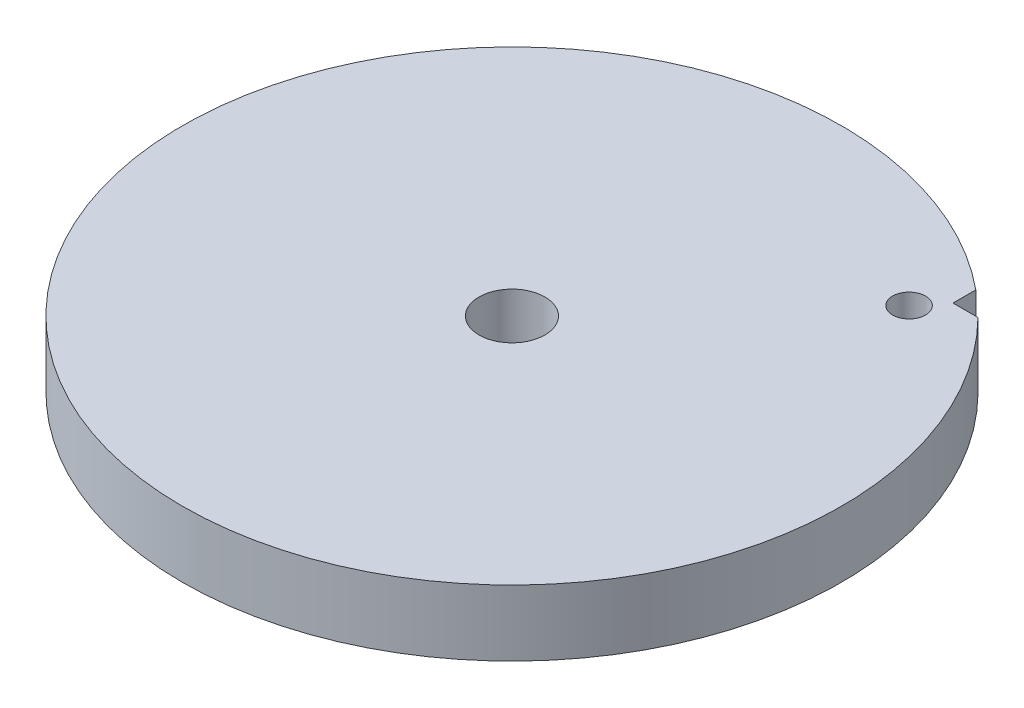
ISO-10303-21;
HEADER;
FILE_DESCRIPTION(('STEP AP214'),'2;1');
FILE_NAME('part.step','',(''),(''),'','','');
FILE_SCHEMA(('AUTOMOTIVE_DESIGN { 1 0 10303 214 1 1 1 1 }'));
ENDSEC;
DATA;
#1=APPLICATION_CONTEXT('core data for automotive mechanical design processes');
#2=APPLICATION_PROTOCOL_DEFINITION('international standard','automotive_design',2000,#1);
#3=PRODUCT_CONTEXT('',#1,'mechanical');
#4=PRODUCT('Part','Part','',(#3));
#5=PRODUCT_RELATED_PRODUCT_CATEGORY('part','',(#4));
#6=PRODUCT_DEFINITION_FORMATION('','',#4);
#7=PRODUCT_DEFINITION_CONTEXT('part definition',#1,'design');
#8=PRODUCT_DEFINITION('design','',#6,#7);
#9=PRODUCT_DEFINITION_SHAPE('','',#8);
#10=(LENGTH_UNIT() NAMED_UNIT(*) SI_UNIT(.MILLI.,.METRE.));
#11=(NAMED_UNIT(*) PLANE_ANGLE_UNIT() SI_UNIT($,.RADIAN.));
#12=(NAMED_UNIT(*) SI_UNIT($,.STERADIAN.) SOLID_ANGLE_UNIT());
#13=UNCERTAINTY_MEASURE_WITH_UNIT(LENGTH_MEASURE(1.E-05),#10,'distance_accuracy_value','');
#14=(GEOMETRIC_REPRESENTATION_CONTEXT(3) GLOBAL_UNCERTAINTY_ASSIGNED_CONTEXT((#13)) GLOBAL_UNIT_ASSIGNED_CONTEXT((#10,
#11,#12)) REPRESENTATION_CONTEXT('',''));
#15=CARTESIAN_POINT('',(0.,0.,0.));
#16=DIRECTION('',(0.,0.,1.));
#17=DIRECTION('',(1.,0.,0.));
#18=AXIS2_PLACEMENT_3D('',#15,#16,#17);
#19=CARTESIAN_POINT('',(0.,3.,0.));
#20=DIRECTION('',(0.,1.,0.));
#21=DIRECTION('',(0.,0.,1.));
#22=AXIS2_PLACEMENT_3D('',#19,#20,#21);
#23=PLANE('',#22);
#24=CARTESIAN_POINT('',(0.,3.,0.));
#25=DIRECTION('',(0.,1.,0.));
#26=DIRECTION('',(0.,0.,1.));
#27=AXIS2_PLACEMENT_3D('',#24,#25,#26);
#28=CIRCLE('',#27,1.5);
#29=CARTESIAN_POINT('',(0.,3.,1.5));
#30=VERTEX_POINT('',#29);
#31=EDGE_CURVE('E94',#30,#30,#28,.T.);
#32=ORIENTED_EDGE('',*,*,#31,.F.);
#33=EDGE_LOOP('',(#32));
#34=FACE_BOUND('',#33,.T.);
#35=CARTESIAN_POINT('',(0.,3.,0.));
#36=DIRECTION('',(0.,1.,0.));
#37=DIRECTION('',(0.,0.,1.));
#38=AXIS2_PLACEMENT_3D('',#35,#36,#37);
#39=CIRCLE('',#38,15.);
#40=CARTESIAN_POINT('',(9.52753894994287,3.,-11.5855945707297));
#41=VERTEX_POINT('',#40);
#42=CARTESIAN_POINT('',(10.6660411568137,3.,-10.5468272973988));
#43=VERTEX_POINT('',#42);
#44=EDGE_CURVE('E82',#41,#43,#39,.T.);
#45=ORIENTED_EDGE('',*,*,#44,.T.);
#46=DIRECTION('',(-1.,0.,0.));
#47=VECTOR('',#46,1.);
#48=CARTESIAN_POINT('',(9.52753894994287,3.,-10.5468272973988));
#49=LINE('',#48,#47);
#50=CARTESIAN_POINT('',(9.52753894994287,3.,-10.5468272973988));
#51=VERTEX_POINT('',#50);
#52=EDGE_CURVE('E77',#43,#51,#49,.T.);
#53=ORIENTED_EDGE('',*,*,#52,.T.);
#54=DIRECTION('',(0.,0.,-1.));
#55=VECTOR('',#54,1.);
#56=CARTESIAN_POINT('',(9.52753894994287,3.,-11.5855945707297));
#57=LINE('',#56,#55);
#58=EDGE_CURVE('E57',#51,#41,#57,.T.);
#59=ORIENTED_EDGE('',*,*,#58,.T.);
#60=EDGE_LOOP('',(#45,#53,#59));
#61=FACE_BOUND('',#60,.T.);
#62=CARTESIAN_POINT('',(8.62586921498167,3.,-9.44919669777989));
#63=DIRECTION('',(0.,1.,0.));
#64=DIRECTION('',(0.,0.,1.));
#65=AXIS2_PLACEMENT_3D('',#62,#63,#64);
#66=CIRCLE('',#65,0.75);
#67=CARTESIAN_POINT('',(8.62586921498167,3.,-8.69919669777989));
#68=VERTEX_POINT('',#67);
#69=EDGE_CURVE('E121',#68,#68,#66,.T.);
#70=ORIENTED_EDGE('',*,*,#69,.F.);
#71=EDGE_LOOP('',(#70));
#72=FACE_BOUND('',#71,.T.);
#73=ADVANCED_FACE('F39',(#34,#61,#72),#23,.T.);
#74=CARTESIAN_POINT('',(0.,0.,0.));
#75=DIRECTION('',(0.,1.,0.));
#76=DIRECTION('',(0.,0.,1.));
#77=AXIS2_PLACEMENT_3D('',#74,#75,#76);
#78=PLANE('',#77);
#79=CARTESIAN_POINT('',(0.,0.,0.));
#80=DIRECTION('',(0.,1.,0.));
#81=DIRECTION('',(0.,0.,1.));
#82=AXIS2_PLACEMENT_3D('',#79,#80,#81);
#83=CIRCLE('',#82,15.);
#84=CARTESIAN_POINT('',(9.52753894994287,0.,-11.5855945707297));
#85=VERTEX_POINT('',#84);
#86=CARTESIAN_POINT('',(10.6660411568137,0.,-10.5468272973988));
#87=VERTEX_POINT('',#86);
#88=EDGE_CURVE('E90',#85,#87,#83,.T.);
#89=ORIENTED_EDGE('',*,*,#88,.F.);
#90=DIRECTION('',(0.,0.,-1.));
#91=VECTOR('',#90,1.);
#92=CARTESIAN_POINT('',(9.52753894994287,0.,-11.5855945707297));
#93=LINE('',#92,#91);
#94=CARTESIAN_POINT('',(9.52753894994287,0.,-10.5468272973988));
#95=VERTEX_POINT('',#94);
#96=EDGE_CURVE('E74',#95,#85,#93,.T.);
#97=ORIENTED_EDGE('',*,*,#96,.F.);
#98=DIRECTION('',(-1.,0.,0.));
#99=VECTOR('',#98,1.);
#100=CARTESIAN_POINT('',(9.52753894994287,0.,-10.5468272973988));
#101=LINE('',#100,#99);
#102=EDGE_CURVE('E69',#87,#95,#101,.T.);
#103=ORIENTED_EDGE('',*,*,#102,.F.);
#104=EDGE_LOOP('',(#89,#97,#103));
#105=FACE_BOUND('',#104,.T.);
#106=CARTESIAN_POINT('',(0.,0.,0.));
#107=DIRECTION('',(0.,1.,0.));
#108=DIRECTION('',(0.,0.,1.));
#109=AXIS2_PLACEMENT_3D('',#106,#107,#108);
#110=CIRCLE('',#109,1.5);
#111=CARTESIAN_POINT('',(0.,0.,1.5));
#112=VERTEX_POINT('',#111);
#113=EDGE_CURVE('E100',#112,#112,#110,.T.);
#114=ORIENTED_EDGE('',*,*,#113,.T.);
#115=EDGE_LOOP('',(#114));
#116=FACE_BOUND('',#115,.T.);
#117=CARTESIAN_POINT('',(8.62586921498167,0.,-9.44919669777989));
#118=DIRECTION('',(0.,1.,0.));
#119=DIRECTION('',(0.,0.,1.));
#120=AXIS2_PLACEMENT_3D('',#117,#118,#119);
#121=CIRCLE('',#120,0.75);
#122=CARTESIAN_POINT('',(8.62586921498167,0.,-8.69919669777989));
#123=VERTEX_POINT('',#122);
#124=EDGE_CURVE('E118',#123,#123,#121,.T.);
#125=ORIENTED_EDGE('',*,*,#124,.T.);
#126=EDGE_LOOP('',(#125));
#127=FACE_BOUND('',#126,.T.);
#128=ADVANCED_FACE('F109',(#105,#116,#127),#78,.F.);
#129=CARTESIAN_POINT('',(0.,3.,0.));
#130=DIRECTION('',(0.,-1.,0.));
#131=DIRECTION('',(0.,0.,-1.));
#132=AXIS2_PLACEMENT_3D('',#129,#130,#131);
#133=CYLINDRICAL_SURFACE('',#132,15.);
#134=ORIENTED_EDGE('',*,*,#88,.T.);
#135=DIRECTION('',(0.,-1.,0.));
#136=VECTOR('',#135,1.);
#137=CARTESIAN_POINT('',(10.6660411568137,3.,-10.5468272973988));
#138=LINE('',#137,#136);
#139=EDGE_CURVE('E11',#43,#87,#138,.T.);
#140=ORIENTED_EDGE('',*,*,#139,.F.);
#141=ORIENTED_EDGE('',*,*,#44,.F.);
#142=DIRECTION('',(0.,-1.,0.));
#143=VECTOR('',#142,1.);
#144=CARTESIAN_POINT('',(9.52753894994287,3.,-11.5855945707297));
#145=LINE('',#144,#143);
#146=EDGE_CURVE('E91',#41,#85,#145,.T.);
#147=ORIENTED_EDGE('',*,*,#146,.T.);
#148=EDGE_LOOP('',(#134,#140,#141,#147));
#149=FACE_BOUND('',#148,.T.);
#150=ADVANCED_FACE('F41',(#149),#133,.T.);
#151=CARTESIAN_POINT('',(9.52753894994287,3.,-10.5468272973988));
#152=DIRECTION('',(0.,0.,1.));
#153=DIRECTION('',(1.,0.,0.));
#154=AXIS2_PLACEMENT_3D('',#151,#152,#153);
#155=PLANE('',#154);
#156=ORIENTED_EDGE('',*,*,#102,.T.);
#157=DIRECTION('',(0.,-1.,0.));
#158=VECTOR('',#157,1.);
#159=CARTESIAN_POINT('',(9.52753894994287,3.,-10.5468272973988));
#160=LINE('',#159,#158);
#161=EDGE_CURVE('E49',#51,#95,#160,.T.);
#162=ORIENTED_EDGE('',*,*,#161,.F.);
#163=ORIENTED_EDGE('',*,*,#52,.F.);
#164=ORIENTED_EDGE('',*,*,#139,.T.);
#165=EDGE_LOOP('',(#156,#162,#163,#164));
#166=FACE_BOUND('',#165,.T.);
#167=ADVANCED_FACE('F78',(#166),#155,.F.);
#168=CARTESIAN_POINT('',(9.52753894994287,3.,-11.5855945707297));
#169=DIRECTION('',(-1.,0.,0.));
#170=DIRECTION('',(0.,0.,1.));
#171=AXIS2_PLACEMENT_3D('',#168,#169,#170);
#172=PLANE('',#171);
#173=ORIENTED_EDGE('',*,*,#96,.T.);
#174=ORIENTED_EDGE('',*,*,#146,.F.);
#175=ORIENTED_EDGE('',*,*,#58,.F.);
#176=ORIENTED_EDGE('',*,*,#161,.T.);
#177=EDGE_LOOP('',(#173,#174,#175,#176));
#178=FACE_BOUND('',#177,.T.);
#179=ADVANCED_FACE('F108',(#178),#172,.F.);
#180=CARTESIAN_POINT('',(0.,3.,0.));
#181=DIRECTION('',(0.,-1.,0.));
#182=DIRECTION('',(0.,0.,-1.));
#183=AXIS2_PLACEMENT_3D('',#180,#181,#182);
#184=CYLINDRICAL_SURFACE('',#183,1.5);
#185=ORIENTED_EDGE('',*,*,#31,.T.);
#186=EDGE_LOOP('',(#185));
#187=FACE_BOUND('',#186,.T.);
#188=ORIENTED_EDGE('',*,*,#113,.F.);
#189=EDGE_LOOP('',(#188));
#190=FACE_BOUND('',#189,.T.);
#191=ADVANCED_FACE('F138',(#187,#190),#184,.F.);
#192=CARTESIAN_POINT('',(8.62586921498167,3.,-9.44919669777989));
#193=DIRECTION('',(0.,-1.,0.));
#194=DIRECTION('',(0.,0.,-1.));
#195=AXIS2_PLACEMENT_3D('',#192,#193,#194);
#196=CYLINDRICAL_SURFACE('',#195,0.75);
#197=ORIENTED_EDGE('',*,*,#69,.T.);
#198=EDGE_LOOP('',(#197));
#199=FACE_BOUND('',#198,.T.);
#200=ORIENTED_EDGE('',*,*,#124,.F.);
#201=EDGE_LOOP('',(#200));
#202=FACE_BOUND('',#201,.T.);
#203=ADVANCED_FACE('F130',(#199,#202),#196,.F.);
#204=CLOSED_SHELL('',(#73,#128,#150,#167,#179,#191,#203));
#205=MANIFOLD_SOLID_BREP('B2',#204);
#206=ADVANCED_BREP_SHAPE_REPRESENTATION('',(#18,#205),#14);
#207=SHAPE_DEFINITION_REPRESENTATION(#9,#206);
ENDSEC;
END-ISO-10303-21;
